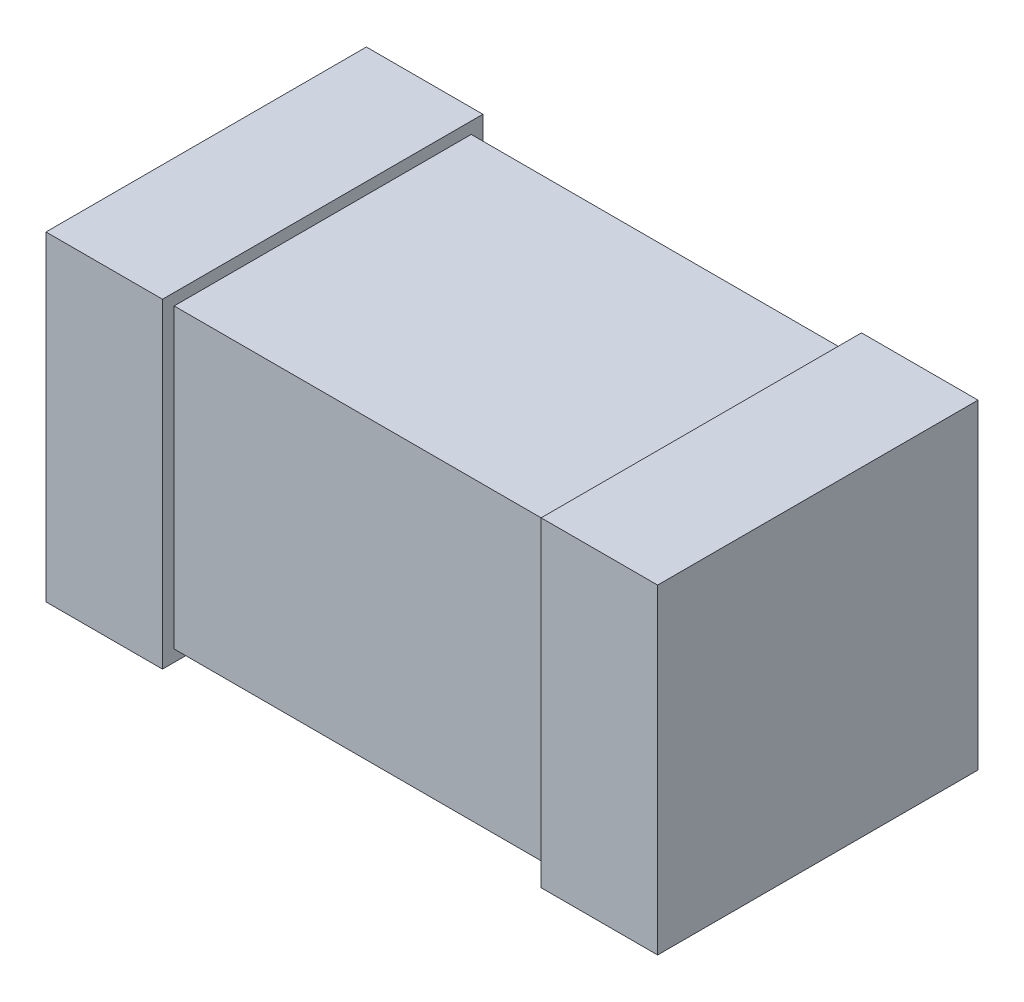
ISO-10303-21;
HEADER;
FILE_DESCRIPTION(('STEP AP214'),'2;1');
FILE_NAME('part.step','',(''),(''),'','','');
FILE_SCHEMA(('AUTOMOTIVE_DESIGN { 1 0 10303 214 1 1 1 1 }'));
ENDSEC;
DATA;
#1=APPLICATION_CONTEXT('core data for automotive mechanical design processes');
#2=APPLICATION_PROTOCOL_DEFINITION('international standard','automotive_design',2000,#1);
#3=PRODUCT_CONTEXT('',#1,'mechanical');
#4=PRODUCT('Part','Part','',(#3));
#5=PRODUCT_RELATED_PRODUCT_CATEGORY('part','',(#4));
#6=PRODUCT_DEFINITION_FORMATION('','',#4);
#7=PRODUCT_DEFINITION_CONTEXT('part definition',#1,'design');
#8=PRODUCT_DEFINITION('design','',#6,#7);
#9=PRODUCT_DEFINITION_SHAPE('','',#8);
#10=(LENGTH_UNIT() NAMED_UNIT(*) SI_UNIT(.MILLI.,.METRE.));
#11=(NAMED_UNIT(*) PLANE_ANGLE_UNIT() SI_UNIT($,.RADIAN.));
#12=(NAMED_UNIT(*) SI_UNIT($,.STERADIAN.) SOLID_ANGLE_UNIT());
#13=UNCERTAINTY_MEASURE_WITH_UNIT(LENGTH_MEASURE(1.E-05),#10,'distance_accuracy_value','');
#14=(GEOMETRIC_REPRESENTATION_CONTEXT(3) GLOBAL_UNCERTAINTY_ASSIGNED_CONTEXT((#13)) GLOBAL_UNIT_ASSIGNED_CONTEXT((#10,
#11,#12)) REPRESENTATION_CONTEXT('',''));
#15=CARTESIAN_POINT('',(0.,0.,0.));
#16=DIRECTION('',(0.,0.,1.));
#17=DIRECTION('',(1.,0.,0.));
#18=AXIS2_PLACEMENT_3D('',#15,#16,#17);
#19=CARTESIAN_POINT('',(-0.524999999868,0.275,291599.6864351));
#20=DIRECTION('',(-1.,0.,0.));
#21=DIRECTION('',(0.,0.,1.));
#22=AXIS2_PLACEMENT_3D('',#19,#20,#21);
#23=PLANE('',#22);
#24=DIRECTION('',(0.,0.,-1.));
#25=VECTOR('',#24,1.);
#26=CARTESIAN_POINT('',(-0.524999999982,0.275,2.624874792694E-11));
#27=LINE('',#26,#25);
#28=CARTESIAN_POINT('',(-0.524999999982216,0.275,0.549999999975906));
#29=VERTEX_POINT('',#28);
#30=CARTESIAN_POINT('',(-0.524999999982192,0.275,1.96865609451871E-11));
#31=VERTEX_POINT('',#30);
#32=EDGE_CURVE('E117',#29,#31,#27,.T.);
#33=ORIENTED_EDGE('',*,*,#32,.T.);
#34=DIRECTION('',(0.,1.,0.));
#35=VECTOR('',#34,1.);
#36=CARTESIAN_POINT('',(-0.524999999981901,0.275,2.62487479269042E-11));
#37=LINE('',#36,#35);
#38=CARTESIAN_POINT('',(-0.524999999982216,-0.275,1.9686560945196E-11));
#39=VERTEX_POINT('',#38);
#40=EDGE_CURVE('E104',#39,#31,#37,.T.);
#41=ORIENTED_EDGE('',*,*,#40,.F.);
#42=DIRECTION('',(0.,0.,-1.));
#43=VECTOR('',#42,1.);
#44=CARTESIAN_POINT('',(-0.524999999982,-0.275,2.624874792694E-11));
#45=LINE('',#44,#43);
#46=CARTESIAN_POINT('',(-0.524999999982216,-0.275,0.549999999975906));
#47=VERTEX_POINT('',#46);
#48=EDGE_CURVE('E20',#47,#39,#45,.T.);
#49=ORIENTED_EDGE('',*,*,#48,.F.);
#50=DIRECTION('',(0.,1.,0.));
#51=VECTOR('',#50,1.);
#52=CARTESIAN_POINT('',(-0.524999999981901,0.275,0.549999999976));
#53=LINE('',#52,#51);
#54=EDGE_CURVE('E132',#29,#47,#53,.F.);
#55=ORIENTED_EDGE('',*,*,#54,.F.);
#56=EDGE_LOOP('',(#33,#41,#49,#55));
#57=FACE_BOUND('',#56,.T.);
#58=ADVANCED_FACE('F17',(#57),#23,.T.);
#59=CARTESIAN_POINT('',(0.524999999982,0.275,291599.6864351));
#60=DIRECTION('',(1.,0.,0.));
#61=DIRECTION('',(0.,0.,-1.));
#62=AXIS2_PLACEMENT_3D('',#59,#60,#61);
#63=PLANE('',#62);
#64=DIRECTION('',(0.,0.,-1.));
#65=VECTOR('',#64,1.);
#66=CARTESIAN_POINT('',(0.524999999982,0.275,0.549999999976));
#67=LINE('',#66,#65);
#68=CARTESIAN_POINT('',(0.524999999981975,0.275,-7.89975113860077E-12));
#69=VERTEX_POINT('',#68);
#70=CARTESIAN_POINT('',(0.52499999998195,0.275,0.549999999975906));
#71=VERTEX_POINT('',#70);
#72=EDGE_CURVE('E143',#69,#71,#67,.F.);
#73=ORIENTED_EDGE('',*,*,#72,.T.);
#74=DIRECTION('',(0.,1.,0.));
#75=VECTOR('',#74,1.);
#76=CARTESIAN_POINT('',(0.524999999981901,0.275,0.549999999976));
#77=LINE('',#76,#75);
#78=CARTESIAN_POINT('',(0.524999999981975,-0.275,0.549999999975906));
#79=VERTEX_POINT('',#78);
#80=EDGE_CURVE('E139',#79,#71,#77,.T.);
#81=ORIENTED_EDGE('',*,*,#80,.F.);
#82=DIRECTION('',(0.,0.,-1.));
#83=VECTOR('',#82,1.);
#84=CARTESIAN_POINT('',(0.524999999982,-0.275,0.549999999976));
#85=LINE('',#84,#83);
#86=CARTESIAN_POINT('',(0.524999999981975,-0.275,-7.89975113860077E-12));
#87=VERTEX_POINT('',#86);
#88=EDGE_CURVE('E134',#87,#79,#85,.F.);
#89=ORIENTED_EDGE('',*,*,#88,.F.);
#90=DIRECTION('',(0.,1.,0.));
#91=VECTOR('',#90,1.);
#92=CARTESIAN_POINT('',(0.524999999981901,0.275,-1.05329563430097E-11));
#93=LINE('',#92,#91);
#94=EDGE_CURVE('E152',#69,#87,#93,.F.);
#95=ORIENTED_EDGE('',*,*,#94,.F.);
#96=EDGE_LOOP('',(#73,#81,#89,#95));
#97=FACE_BOUND('',#96,.T.);
#98=ADVANCED_FACE('F378',(#97),#63,.T.);
#99=CARTESIAN_POINT('',(-0.524999999982,-0.275,2.624874792694E-11));
#100=DIRECTION('',(0.,-1.,0.));
#101=DIRECTION('',(0.,0.,-1.));
#102=AXIS2_PLACEMENT_3D('',#99,#100,#101);
#103=PLANE('',#102);
#104=DIRECTION('',(0.,0.,-1.));
#105=VECTOR('',#104,1.);
#106=CARTESIAN_POINT('',(-0.324999999862,-0.275,291599.6864351));
#107=LINE('',#106,#105);
#108=CARTESIAN_POINT('',(-0.324999999976557,-0.275,0.549999999975906));
#109=VERTEX_POINT('',#108);
#110=CARTESIAN_POINT('',(-0.324999999976557,-0.275,1.96865215936737E-11));
#111=VERTEX_POINT('',#110);
#112=EDGE_CURVE('E158',#109,#111,#107,.T.);
#113=ORIENTED_EDGE('',*,*,#112,.F.);
#114=DIRECTION('',(1.,0.,0.));
#115=VECTOR('',#114,1.);
#116=CARTESIAN_POINT('',(-400000.,-0.275,0.549999999976));
#117=LINE('',#116,#115);
#118=EDGE_CURVE('E113',#47,#109,#117,.T.);
#119=ORIENTED_EDGE('',*,*,#118,.F.);
#120=ORIENTED_EDGE('',*,*,#48,.T.);
#121=DIRECTION('',(-1.,0.,0.));
#122=VECTOR('',#121,1.);
#123=CARTESIAN_POINT('',(-400000.,-0.275,3.410605131648E-10));
#124=LINE('',#123,#122);
#125=EDGE_CURVE('E110',#111,#39,#124,.T.);
#126=ORIENTED_EDGE('',*,*,#125,.F.);
#127=EDGE_LOOP('',(#113,#119,#120,#126));
#128=FACE_BOUND('',#127,.T.);
#129=ADVANCED_FACE('F109',(#128),#103,.T.);
#130=CARTESIAN_POINT('',(-400000.,0.275,3.410605131648E-10));
#131=DIRECTION('',(0.,0.,-1.));
#132=DIRECTION('',(-1.,0.,0.));
#133=AXIS2_PLACEMENT_3D('',#130,#131,#132);
#134=PLANE('',#133);
#135=DIRECTION('',(1.,0.,0.));
#136=VECTOR('',#135,1.);
#137=CARTESIAN_POINT('',(-0.524999999982,0.275,2.624874792694E-11));
#138=LINE('',#137,#136);
#139=CARTESIAN_POINT('',(-0.324999999976122,0.275,1.96864822421425E-11));
#140=VERTEX_POINT('',#139);
#141=EDGE_CURVE('E119',#31,#140,#138,.T.);
#142=ORIENTED_EDGE('',*,*,#141,.T.);
#143=DIRECTION('',(0.,1.,0.));
#144=VECTOR('',#143,1.);
#145=CARTESIAN_POINT('',(-0.324999999976965,0.275,0.));
#146=LINE('',#145,#144);
#147=EDGE_CURVE('E123',#111,#140,#146,.T.);
#148=ORIENTED_EDGE('',*,*,#147,.F.);
#149=ORIENTED_EDGE('',*,*,#125,.T.);
#150=ORIENTED_EDGE('',*,*,#40,.T.);
#151=EDGE_LOOP('',(#142,#148,#149,#150));
#152=FACE_BOUND('',#151,.T.);
#153=ADVANCED_FACE('F121',(#152),#134,.T.);
#154=CARTESIAN_POINT('',(-0.524999999982,0.275,2.624874792694E-11));
#155=DIRECTION('',(0.,-1.,0.));
#156=DIRECTION('',(0.,0.,-1.));
#157=AXIS2_PLACEMENT_3D('',#154,#155,#156);
#158=PLANE('',#157);
#159=DIRECTION('',(1.,0.,0.));
#160=VECTOR('',#159,1.);
#161=CARTESIAN_POINT('',(-400000.,0.275,0.549999999976));
#162=LINE('',#161,#160);
#163=CARTESIAN_POINT('',(-0.324999999976557,0.275,0.549999999975906));
#164=VERTEX_POINT('',#163);
#165=EDGE_CURVE('E129',#164,#29,#162,.F.);
#166=ORIENTED_EDGE('',*,*,#165,.F.);
#167=DIRECTION('',(0.,0.,-1.));
#168=VECTOR('',#167,1.);
#169=CARTESIAN_POINT('',(-0.324999999862,0.275,291599.6864351));
#170=LINE('',#169,#168);
#171=EDGE_CURVE('E161',#140,#164,#170,.F.);
#172=ORIENTED_EDGE('',*,*,#171,.F.);
#173=ORIENTED_EDGE('',*,*,#141,.F.);
#174=ORIENTED_EDGE('',*,*,#32,.F.);
#175=EDGE_LOOP('',(#166,#172,#173,#174));
#176=FACE_BOUND('',#175,.T.);
#177=ADVANCED_FACE('F351',(#176),#158,.F.);
#178=CARTESIAN_POINT('',(-400000.,0.275,0.549999999976));
#179=DIRECTION('',(0.,0.,1.));
#180=DIRECTION('',(1.,0.,0.));
#181=AXIS2_PLACEMENT_3D('',#178,#179,#180);
#182=PLANE('',#181);
#183=ORIENTED_EDGE('',*,*,#165,.T.);
#184=ORIENTED_EDGE('',*,*,#54,.T.);
#185=ORIENTED_EDGE('',*,*,#118,.T.);
#186=DIRECTION('',(0.,1.,0.));
#187=VECTOR('',#186,1.);
#188=CARTESIAN_POINT('',(-0.324999999976965,0.275,0.549999999975626));
#189=LINE('',#188,#187);
#190=EDGE_CURVE('E164',#164,#109,#189,.F.);
#191=ORIENTED_EDGE('',*,*,#190,.F.);
#192=EDGE_LOOP('',(#183,#184,#185,#191));
#193=FACE_BOUND('',#192,.T.);
#194=ADVANCED_FACE('F341',(#193),#182,.T.);
#195=CARTESIAN_POINT('',(0.524999999982,-0.275,0.549999999976));
#196=DIRECTION('',(0.,-1.,0.));
#197=DIRECTION('',(0.,0.,-1.));
#198=AXIS2_PLACEMENT_3D('',#195,#196,#197);
#199=PLANE('',#198);
#200=DIRECTION('',(0.,0.,1.));
#201=VECTOR('',#200,1.);
#202=CARTESIAN_POINT('',(0.324999999975,-0.275,291599.6864351));
#203=LINE('',#202,#201);
#204=CARTESIAN_POINT('',(0.324999999975065,-0.275,-7.89977824365508E-12));
#205=VERTEX_POINT('',#204);
#206=CARTESIAN_POINT('',(0.324999999975065,-0.275,0.549999999975906));
#207=VERTEX_POINT('',#206);
#208=EDGE_CURVE('E177',#205,#207,#203,.T.);
#209=ORIENTED_EDGE('',*,*,#208,.F.);
#210=DIRECTION('',(-1.,0.,0.));
#211=VECTOR('',#210,1.);
#212=CARTESIAN_POINT('',(-400000.,-0.275,-2.273736754432E-10));
#213=LINE('',#212,#211);
#214=EDGE_CURVE('E146',#87,#205,#213,.T.);
#215=ORIENTED_EDGE('',*,*,#214,.F.);
#216=ORIENTED_EDGE('',*,*,#88,.T.);
#217=DIRECTION('',(1.,0.,0.));
#218=VECTOR('',#217,1.);
#219=CARTESIAN_POINT('',(-400000.,-0.275,0.549999999976));
#220=LINE('',#219,#218);
#221=EDGE_CURVE('E136',#207,#79,#220,.T.);
#222=ORIENTED_EDGE('',*,*,#221,.F.);
#223=EDGE_LOOP('',(#209,#215,#216,#222));
#224=FACE_BOUND('',#223,.T.);
#225=ADVANCED_FACE('F331',(#224),#199,.T.);
#226=CARTESIAN_POINT('',(-400000.,0.275,0.549999999976));
#227=DIRECTION('',(0.,0.,1.));
#228=DIRECTION('',(1.,0.,0.));
#229=AXIS2_PLACEMENT_3D('',#226,#227,#228);
#230=PLANE('',#229);
#231=DIRECTION('',(1.,0.,0.));
#232=VECTOR('',#231,1.);
#233=CARTESIAN_POINT('',(0.524999999982,0.275,0.549999999976));
#234=LINE('',#233,#232);
#235=CARTESIAN_POINT('',(0.324999999975131,0.275,0.549999999975906));
#236=VERTEX_POINT('',#235);
#237=EDGE_CURVE('E141',#71,#236,#234,.F.);
#238=ORIENTED_EDGE('',*,*,#237,.T.);
#239=DIRECTION('',(0.,1.,0.));
#240=VECTOR('',#239,1.);
#241=CARTESIAN_POINT('',(0.324999999975,0.275,0.549999999975626));
#242=LINE('',#241,#240);
#243=EDGE_CURVE('E180',#207,#236,#242,.T.);
#244=ORIENTED_EDGE('',*,*,#243,.F.);
#245=ORIENTED_EDGE('',*,*,#221,.T.);
#246=ORIENTED_EDGE('',*,*,#80,.T.);
#247=EDGE_LOOP('',(#238,#244,#245,#246));
#248=FACE_BOUND('',#247,.T.);
#249=ADVANCED_FACE('F321',(#248),#230,.T.);
#250=CARTESIAN_POINT('',(0.524999999982,0.275,0.549999999976));
#251=DIRECTION('',(0.,-1.,0.));
#252=DIRECTION('',(0.,0.,-1.));
#253=AXIS2_PLACEMENT_3D('',#250,#251,#252);
#254=PLANE('',#253);
#255=DIRECTION('',(-1.,0.,0.));
#256=VECTOR('',#255,1.);
#257=CARTESIAN_POINT('',(-400000.,0.275,-2.273736754432E-10));
#258=LINE('',#257,#256);
#259=CARTESIAN_POINT('',(0.324999999975065,0.275,-7.89977824365508E-12));
#260=VERTEX_POINT('',#259);
#261=EDGE_CURVE('E149',#260,#69,#258,.F.);
#262=ORIENTED_EDGE('',*,*,#261,.F.);
#263=DIRECTION('',(0.,0.,1.));
#264=VECTOR('',#263,1.);
#265=CARTESIAN_POINT('',(0.324999999975,0.275,291599.6864351));
#266=LINE('',#265,#264);
#267=EDGE_CURVE('E183',#236,#260,#266,.F.);
#268=ORIENTED_EDGE('',*,*,#267,.F.);
#269=ORIENTED_EDGE('',*,*,#237,.F.);
#270=ORIENTED_EDGE('',*,*,#72,.F.);
#271=EDGE_LOOP('',(#262,#268,#269,#270));
#272=FACE_BOUND('',#271,.T.);
#273=ADVANCED_FACE('F311',(#272),#254,.F.);
#274=CARTESIAN_POINT('',(-400000.,0.275,-2.273736754432E-10));
#275=DIRECTION('',(0.,0.,-1.));
#276=DIRECTION('',(-1.,0.,0.));
#277=AXIS2_PLACEMENT_3D('',#274,#275,#276);
#278=PLANE('',#277);
#279=ORIENTED_EDGE('',*,*,#261,.T.);
#280=ORIENTED_EDGE('',*,*,#94,.T.);
#281=ORIENTED_EDGE('',*,*,#214,.T.);
#282=DIRECTION('',(0.,1.,0.));
#283=VECTOR('',#282,1.);
#284=CARTESIAN_POINT('',(0.324999999975,0.275,0.));
#285=LINE('',#284,#283);
#286=EDGE_CURVE('E186',#260,#205,#285,.F.);
#287=ORIENTED_EDGE('',*,*,#286,.F.);
#288=EDGE_LOOP('',(#279,#280,#281,#287));
#289=FACE_BOUND('',#288,.T.);
#290=ADVANCED_FACE('F227',(#289),#278,.T.);
#291=CARTESIAN_POINT('',(-0.324999999975,0.255,0.530000000026));
#292=DIRECTION('',(0.,-1.,0.));
#293=DIRECTION('',(0.,0.,-1.));
#294=AXIS2_PLACEMENT_3D('',#291,#292,#293);
#295=PLANE('',#294);
#296=DIRECTION('',(0.,0.,1.));
#297=VECTOR('',#296,1.);
#298=CARTESIAN_POINT('',(0.324999999975,0.255,291599.6864351));
#299=LINE('',#298,#297);
#300=CARTESIAN_POINT('',(0.324999999975065,0.255,0.0200000000063496));
#301=VERTEX_POINT('',#300);
#302=CARTESIAN_POINT('',(0.324999999975065,0.255,0.53000000002603));
#303=VERTEX_POINT('',#302);
#304=EDGE_CURVE('E189',#301,#303,#299,.T.);
#305=ORIENTED_EDGE('',*,*,#304,.F.);
#306=DIRECTION('',(-1.,0.,0.));
#307=VECTOR('',#306,1.);
#308=CARTESIAN_POINT('',(-400000.,0.255,0.02000000000635));
#309=LINE('',#308,#307);
#310=CARTESIAN_POINT('',(-0.324999999976048,0.255,0.0200000000063491));
#311=VERTEX_POINT('',#310);
#312=EDGE_CURVE('E175',#311,#301,#309,.F.);
#313=ORIENTED_EDGE('',*,*,#312,.F.);
#314=DIRECTION('',(0.,0.,-1.));
#315=VECTOR('',#314,1.);
#316=CARTESIAN_POINT('',(-0.324999999862,0.255,291599.6864351));
#317=LINE('',#316,#315);
#318=CARTESIAN_POINT('',(-0.324999999975557,0.255,0.53000000002603));
#319=VERTEX_POINT('',#318);
#320=EDGE_CURVE('E167',#319,#311,#317,.T.);
#321=ORIENTED_EDGE('',*,*,#320,.F.);
#322=DIRECTION('',(1.,0.,0.));
#323=VECTOR('',#322,1.);
#324=CARTESIAN_POINT('',(-400000.,0.255,0.530000000026));
#325=LINE('',#324,#323);
#326=EDGE_CURVE('E155',#303,#319,#325,.F.);
#327=ORIENTED_EDGE('',*,*,#326,.F.);
#328=EDGE_LOOP('',(#305,#313,#321,#327));
#329=FACE_BOUND('',#328,.T.);
#330=ADVANCED_FACE('F212',(#329),#295,.F.);
#331=CARTESIAN_POINT('',(-400000.,0.255,0.530000000026));
#332=DIRECTION('',(0.,0.,1.));
#333=DIRECTION('',(1.,0.,0.));
#334=AXIS2_PLACEMENT_3D('',#331,#332,#333);
#335=PLANE('',#334);
#336=ORIENTED_EDGE('',*,*,#326,.T.);
#337=DIRECTION('',(0.,1.,0.));
#338=VECTOR('',#337,1.);
#339=CARTESIAN_POINT('',(-0.324999999976965,0.275,0.530000000026121));
#340=LINE('',#339,#338);
#341=CARTESIAN_POINT('',(-0.324999999976122,-0.255,0.53000000002603));
#342=VERTEX_POINT('',#341);
#343=EDGE_CURVE('E169',#342,#319,#340,.T.);
#344=ORIENTED_EDGE('',*,*,#343,.F.);
#345=DIRECTION('',(1.,0.,0.));
#346=VECTOR('',#345,1.);
#347=CARTESIAN_POINT('',(-0.324999999975,-0.255,0.530000000026));
#348=LINE('',#347,#346);
#349=CARTESIAN_POINT('',(0.324999999975131,-0.255,0.53000000002603));
#350=VERTEX_POINT('',#349);
#351=EDGE_CURVE('E196',#350,#342,#348,.F.);
#352=ORIENTED_EDGE('',*,*,#351,.F.);
#353=DIRECTION('',(0.,1.,0.));
#354=VECTOR('',#353,1.);
#355=CARTESIAN_POINT('',(0.324999999975,0.275,0.530000000026121));
#356=LINE('',#355,#354);
#357=EDGE_CURVE('E192',#303,#350,#356,.F.);
#358=ORIENTED_EDGE('',*,*,#357,.F.);
#359=EDGE_LOOP('',(#336,#344,#352,#358));
#360=FACE_BOUND('',#359,.T.);
#361=ADVANCED_FACE('F218',(#360),#335,.T.);
#362=CARTESIAN_POINT('',(-0.324999999862,0.275,291599.6864351));
#363=DIRECTION('',(1.,0.,0.));
#364=DIRECTION('',(0.,0.,-1.));
#365=AXIS2_PLACEMENT_3D('',#362,#363,#364);
#366=PLANE('',#365);
#367=DIRECTION('',(0.,0.,-1.));
#368=VECTOR('',#367,1.);
#369=CARTESIAN_POINT('',(-0.324999999977,-0.255,0.530000000026));
#370=LINE('',#369,#368);
#371=CARTESIAN_POINT('',(-0.324999999976548,-0.255,0.0200000000063491));
#372=VERTEX_POINT('',#371);
#373=EDGE_CURVE('E199',#342,#372,#370,.T.);
#374=ORIENTED_EDGE('',*,*,#373,.F.);
#375=ORIENTED_EDGE('',*,*,#343,.T.);
#376=ORIENTED_EDGE('',*,*,#320,.T.);
#377=DIRECTION('',(0.,1.,0.));
#378=VECTOR('',#377,1.);
#379=CARTESIAN_POINT('',(-0.324999999975262,0.255,0.02000000000635));
#380=LINE('',#379,#378);
#381=EDGE_CURVE('E172',#372,#311,#380,.T.);
#382=ORIENTED_EDGE('',*,*,#381,.F.);
#383=EDGE_LOOP('',(#374,#375,#376,#382));
#384=FACE_BOUND('',#383,.T.);
#385=ORIENTED_EDGE('',*,*,#171,.T.);
#386=ORIENTED_EDGE('',*,*,#190,.T.);
#387=ORIENTED_EDGE('',*,*,#112,.T.);
#388=ORIENTED_EDGE('',*,*,#147,.T.);
#389=EDGE_LOOP('',(#385,#386,#387,#388));
#390=FACE_BOUND('',#389,.T.);
#391=ADVANCED_FACE('F209',(#384,#390),#366,.T.);
#392=CARTESIAN_POINT('',(-400000.,0.255,0.02000000000635));
#393=DIRECTION('',(0.,0.,-1.));
#394=DIRECTION('',(-1.,0.,0.));
#395=AXIS2_PLACEMENT_3D('',#392,#393,#394);
#396=PLANE('',#395);
#397=ORIENTED_EDGE('',*,*,#312,.T.);
#398=DIRECTION('',(0.,1.,0.));
#399=VECTOR('',#398,1.);
#400=CARTESIAN_POINT('',(0.324999999975,0.275,0.0200000000063483));
#401=LINE('',#400,#399);
#402=CARTESIAN_POINT('',(0.324999999975131,-0.255,0.0200000000063496));
#403=VERTEX_POINT('',#402);
#404=EDGE_CURVE('E35',#403,#301,#401,.T.);
#405=ORIENTED_EDGE('',*,*,#404,.F.);
#406=DIRECTION('',(1.,0.,0.));
#407=VECTOR('',#406,1.);
#408=CARTESIAN_POINT('',(-0.324999999975,-0.255,0.02000000000635));
#409=LINE('',#408,#407);
#410=EDGE_CURVE('E26',#372,#403,#409,.T.);
#411=ORIENTED_EDGE('',*,*,#410,.F.);
#412=ORIENTED_EDGE('',*,*,#381,.T.);
#413=EDGE_LOOP('',(#397,#405,#411,#412));
#414=FACE_BOUND('',#413,.T.);
#415=ADVANCED_FACE('F206',(#414),#396,.T.);
#416=CARTESIAN_POINT('',(0.324999999975,0.275,291599.6864351));
#417=DIRECTION('',(-1.,0.,0.));
#418=DIRECTION('',(0.,0.,1.));
#419=AXIS2_PLACEMENT_3D('',#416,#417,#418);
#420=PLANE('',#419);
#421=DIRECTION('',(0.,0.,-1.));
#422=VECTOR('',#421,1.);
#423=CARTESIAN_POINT('',(0.324999999975,-0.255,0.530000000026));
#424=LINE('',#423,#422);
#425=EDGE_CURVE('E11',#403,#350,#424,.F.);
#426=ORIENTED_EDGE('',*,*,#425,.F.);
#427=ORIENTED_EDGE('',*,*,#404,.T.);
#428=ORIENTED_EDGE('',*,*,#304,.T.);
#429=ORIENTED_EDGE('',*,*,#357,.T.);
#430=EDGE_LOOP('',(#426,#427,#428,#429));
#431=FACE_BOUND('',#430,.T.);
#432=ORIENTED_EDGE('',*,*,#267,.T.);
#433=ORIENTED_EDGE('',*,*,#286,.T.);
#434=ORIENTED_EDGE('',*,*,#208,.T.);
#435=ORIENTED_EDGE('',*,*,#243,.T.);
#436=EDGE_LOOP('',(#432,#433,#434,#435));
#437=FACE_BOUND('',#436,.T.);
#438=ADVANCED_FACE('F215',(#431,#437),#420,.T.);
#439=CARTESIAN_POINT('',(-0.324999999975,-0.255,0.530000000026));
#440=DIRECTION('',(0.,-1.,0.));
#441=DIRECTION('',(0.,0.,-1.));
#442=AXIS2_PLACEMENT_3D('',#439,#440,#441);
#443=PLANE('',#442);
#444=ORIENTED_EDGE('',*,*,#410,.T.);
#445=ORIENTED_EDGE('',*,*,#425,.T.);
#446=ORIENTED_EDGE('',*,*,#351,.T.);
#447=ORIENTED_EDGE('',*,*,#373,.T.);
#448=EDGE_LOOP('',(#444,#445,#446,#447));
#449=FACE_BOUND('',#448,.T.);
#450=ADVANCED_FACE('F204',(#449),#443,.T.);
#451=CLOSED_SHELL('',(#58,#98,#129,#153,#177,#194,#225,#249,#273,#290,#330,#361,#391,#415,#438,#450));
#452=MANIFOLD_SOLID_BREP('B1',#451);
#453=ADVANCED_BREP_SHAPE_REPRESENTATION('',(#18,#452),#14);
#454=SHAPE_DEFINITION_REPRESENTATION(#9,#453);
ENDSEC;
END-ISO-10303-21;
